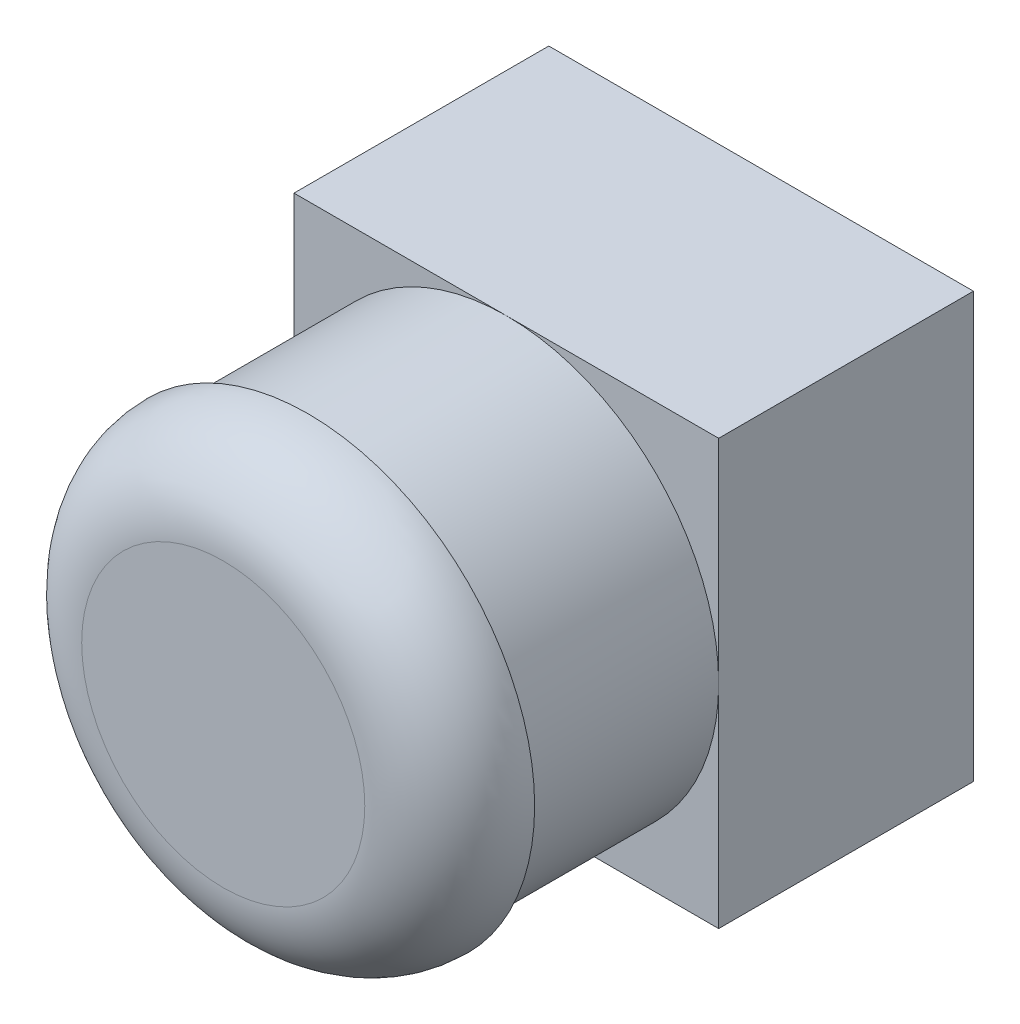
ISO-10303-21;
HEADER;
FILE_DESCRIPTION(('STEP AP214'),'2;1');
FILE_NAME('part.step','',(''),(''),'','','');
FILE_SCHEMA(('AUTOMOTIVE_DESIGN { 1 0 10303 214 1 1 1 1 }'));
ENDSEC;
DATA;
#1=APPLICATION_CONTEXT('core data for automotive mechanical design processes');
#2=APPLICATION_PROTOCOL_DEFINITION('international standard','automotive_design',2000,#1);
#3=PRODUCT_CONTEXT('',#1,'mechanical');
#4=PRODUCT('Part','Part','',(#3));
#5=PRODUCT_RELATED_PRODUCT_CATEGORY('part','',(#4));
#6=PRODUCT_DEFINITION_FORMATION('','',#4);
#7=PRODUCT_DEFINITION_CONTEXT('part definition',#1,'design');
#8=PRODUCT_DEFINITION('design','',#6,#7);
#9=PRODUCT_DEFINITION_SHAPE('','',#8);
#10=(LENGTH_UNIT() NAMED_UNIT(*) SI_UNIT(.MILLI.,.METRE.));
#11=(NAMED_UNIT(*) PLANE_ANGLE_UNIT() SI_UNIT($,.RADIAN.));
#12=(NAMED_UNIT(*) SI_UNIT($,.STERADIAN.) SOLID_ANGLE_UNIT());
#13=UNCERTAINTY_MEASURE_WITH_UNIT(LENGTH_MEASURE(1.E-05),#10,'distance_accuracy_value','');
#14=(GEOMETRIC_REPRESENTATION_CONTEXT(3) GLOBAL_UNCERTAINTY_ASSIGNED_CONTEXT((#13)) GLOBAL_UNIT_ASSIGNED_CONTEXT((#10,
#11,#12)) REPRESENTATION_CONTEXT('',''));
#15=CARTESIAN_POINT('',(0.,0.,0.));
#16=DIRECTION('',(0.,0.,1.));
#17=DIRECTION('',(1.,0.,0.));
#18=AXIS2_PLACEMENT_3D('',#15,#16,#17);
#19=CARTESIAN_POINT('',(0.,0.,9.));
#20=DIRECTION('',(0.,0.,1.));
#21=DIRECTION('',(1.,0.,0.));
#22=AXIS2_PLACEMENT_3D('',#19,#20,#21);
#23=PLANE('',#22);
#24=CARTESIAN_POINT('',(0.,0.,9.));
#25=DIRECTION('',(0.,0.,1.));
#26=DIRECTION('',(1.,0.,0.));
#27=AXIS2_PLACEMENT_3D('',#24,#25,#26);
#28=CIRCLE('',#27,7.5);
#29=CARTESIAN_POINT('',(7.5,0.,9.));
#30=VERTEX_POINT('',#29);
#31=CARTESIAN_POINT('',(0.,7.5,9.));
#32=VERTEX_POINT('',#31);
#33=EDGE_CURVE('E107',#30,#32,#28,.T.);
#34=ORIENTED_EDGE('',*,*,#33,.F.);
#35=DIRECTION('',(0.,1.,0.));
#36=VECTOR('',#35,1.);
#37=CARTESIAN_POINT('',(7.50000000000001,-7.5,9.));
#38=LINE('',#37,#36);
#39=CARTESIAN_POINT('',(7.5,7.5,9.));
#40=VERTEX_POINT('',#39);
#41=EDGE_CURVE('E96',#30,#40,#38,.T.);
#42=ORIENTED_EDGE('',*,*,#41,.T.);
#43=DIRECTION('',(-1.,0.,0.));
#44=VECTOR('',#43,1.);
#45=CARTESIAN_POINT('',(-7.5,7.5,9.));
#46=LINE('',#45,#44);
#47=EDGE_CURVE('E108',#40,#32,#46,.T.);
#48=ORIENTED_EDGE('',*,*,#47,.T.);
#49=EDGE_LOOP('',(#34,#42,#48));
#50=FACE_BOUND('',#49,.T.);
#51=ADVANCED_FACE('F36',(#50),#23,.T.);
#52=CARTESIAN_POINT('',(-7.5,0.,9.));
#53=VERTEX_POINT('',#52);
#54=EDGE_CURVE('E44',#32,#53,#28,.T.);
#55=ORIENTED_EDGE('',*,*,#54,.F.);
#56=CARTESIAN_POINT('',(-7.5,7.5,9.));
#57=VERTEX_POINT('',#56);
#58=EDGE_CURVE('E123',#32,#57,#46,.T.);
#59=ORIENTED_EDGE('',*,*,#58,.T.);
#60=DIRECTION('',(0.,-1.,0.));
#61=VECTOR('',#60,1.);
#62=CARTESIAN_POINT('',(-7.5,-7.5,9.));
#63=LINE('',#62,#61);
#64=EDGE_CURVE('E124',#57,#53,#63,.T.);
#65=ORIENTED_EDGE('',*,*,#64,.T.);
#66=EDGE_LOOP('',(#55,#59,#65));
#67=FACE_BOUND('',#66,.T.);
#68=ADVANCED_FACE('F157',(#67),#23,.T.);
#69=CARTESIAN_POINT('',(0.,-7.5,9.));
#70=VERTEX_POINT('',#69);
#71=EDGE_CURVE('E59',#53,#70,#28,.T.);
#72=ORIENTED_EDGE('',*,*,#71,.F.);
#73=CARTESIAN_POINT('',(-7.5,-7.5,9.));
#74=VERTEX_POINT('',#73);
#75=EDGE_CURVE('E122',#53,#74,#63,.T.);
#76=ORIENTED_EDGE('',*,*,#75,.T.);
#77=DIRECTION('',(1.,0.,0.));
#78=VECTOR('',#77,1.);
#79=CARTESIAN_POINT('',(-7.5,-7.5,9.));
#80=LINE('',#79,#78);
#81=EDGE_CURVE('E105',#74,#70,#80,.T.);
#82=ORIENTED_EDGE('',*,*,#81,.T.);
#83=EDGE_LOOP('',(#72,#76,#82));
#84=FACE_BOUND('',#83,.T.);
#85=ADVANCED_FACE('F159',(#84),#23,.T.);
#86=CARTESIAN_POINT('',(-7.5,7.5,9.));
#87=DIRECTION('',(0.,-1.,0.));
#88=DIRECTION('',(0.,0.,-1.));
#89=AXIS2_PLACEMENT_3D('',#86,#87,#88);
#90=PLANE('',#89);
#91=DIRECTION('',(-1.,0.,0.));
#92=VECTOR('',#91,1.);
#93=CARTESIAN_POINT('',(-7.5,7.5,0.));
#94=LINE('',#93,#92);
#95=CARTESIAN_POINT('',(7.5,7.5,0.));
#96=VERTEX_POINT('',#95);
#97=CARTESIAN_POINT('',(-7.5,7.5,0.));
#98=VERTEX_POINT('',#97);
#99=EDGE_CURVE('E128',#96,#98,#94,.T.);
#100=ORIENTED_EDGE('',*,*,#99,.T.);
#101=DIRECTION('',(0.,0.,-1.));
#102=VECTOR('',#101,1.);
#103=CARTESIAN_POINT('',(-7.5,7.5,9.));
#104=LINE('',#103,#102);
#105=EDGE_CURVE('E115',#57,#98,#104,.T.);
#106=ORIENTED_EDGE('',*,*,#105,.F.);
#107=ORIENTED_EDGE('',*,*,#58,.F.);
#108=ORIENTED_EDGE('',*,*,#47,.F.);
#109=DIRECTION('',(0.,0.,-1.));
#110=VECTOR('',#109,1.);
#111=CARTESIAN_POINT('',(7.5,7.5,9.));
#112=LINE('',#111,#110);
#113=EDGE_CURVE('E95',#40,#96,#112,.T.);
#114=ORIENTED_EDGE('',*,*,#113,.T.);
#115=EDGE_LOOP('',(#100,#106,#107,#108,#114));
#116=FACE_BOUND('',#115,.T.);
#117=ADVANCED_FACE('F152',(#116),#90,.F.);
#118=CARTESIAN_POINT('',(-7.5,-7.5,9.));
#119=DIRECTION('',(1.,0.,0.));
#120=DIRECTION('',(0.,0.,-1.));
#121=AXIS2_PLACEMENT_3D('',#118,#119,#120);
#122=PLANE('',#121);
#123=DIRECTION('',(0.,-1.,0.));
#124=VECTOR('',#123,1.);
#125=CARTESIAN_POINT('',(-7.5,-7.5,0.));
#126=LINE('',#125,#124);
#127=CARTESIAN_POINT('',(-7.5,-7.5,0.));
#128=VERTEX_POINT('',#127);
#129=EDGE_CURVE('E131',#98,#128,#126,.T.);
#130=ORIENTED_EDGE('',*,*,#129,.T.);
#131=DIRECTION('',(0.,0.,-1.));
#132=VECTOR('',#131,1.);
#133=CARTESIAN_POINT('',(-7.5,-7.5,9.));
#134=LINE('',#133,#132);
#135=EDGE_CURVE('E117',#74,#128,#134,.T.);
#136=ORIENTED_EDGE('',*,*,#135,.F.);
#137=ORIENTED_EDGE('',*,*,#75,.F.);
#138=ORIENTED_EDGE('',*,*,#64,.F.);
#139=ORIENTED_EDGE('',*,*,#105,.T.);
#140=EDGE_LOOP('',(#130,#136,#137,#138,#139));
#141=FACE_BOUND('',#140,.T.);
#142=ADVANCED_FACE('F158',(#141),#122,.F.);
#143=CARTESIAN_POINT('',(-7.5,-7.5,9.));
#144=DIRECTION('',(0.,1.,0.));
#145=DIRECTION('',(-1.,0.,0.));
#146=AXIS2_PLACEMENT_3D('',#143,#144,#145);
#147=PLANE('',#146);
#148=DIRECTION('',(1.,0.,0.));
#149=VECTOR('',#148,1.);
#150=CARTESIAN_POINT('',(-7.5,-7.5,0.));
#151=LINE('',#150,#149);
#152=CARTESIAN_POINT('',(7.50000000000001,-7.5,0.));
#153=VERTEX_POINT('',#152);
#154=EDGE_CURVE('E133',#128,#153,#151,.T.);
#155=ORIENTED_EDGE('',*,*,#154,.T.);
#156=DIRECTION('',(0.,0.,-1.));
#157=VECTOR('',#156,1.);
#158=CARTESIAN_POINT('',(7.50000000000001,-7.5,9.));
#159=LINE('',#158,#157);
#160=CARTESIAN_POINT('',(7.50000000000001,-7.5,9.));
#161=VERTEX_POINT('',#160);
#162=EDGE_CURVE('E138',#161,#153,#159,.T.);
#163=ORIENTED_EDGE('',*,*,#162,.F.);
#164=EDGE_CURVE('E91',#70,#161,#80,.T.);
#165=ORIENTED_EDGE('',*,*,#164,.F.);
#166=ORIENTED_EDGE('',*,*,#81,.F.);
#167=ORIENTED_EDGE('',*,*,#135,.T.);
#168=EDGE_LOOP('',(#155,#163,#165,#166,#167));
#169=FACE_BOUND('',#168,.T.);
#170=ADVANCED_FACE('F145',(#169),#147,.F.);
#171=CARTESIAN_POINT('',(7.50000000000001,-7.5,9.));
#172=DIRECTION('',(-1.,0.,0.));
#173=DIRECTION('',(0.,-1.,0.));
#174=AXIS2_PLACEMENT_3D('',#171,#172,#173);
#175=PLANE('',#174);
#176=DIRECTION('',(0.,1.,0.));
#177=VECTOR('',#176,1.);
#178=CARTESIAN_POINT('',(7.50000000000001,-7.5,0.));
#179=LINE('',#178,#177);
#180=EDGE_CURVE('E135',#153,#96,#179,.T.);
#181=ORIENTED_EDGE('',*,*,#180,.T.);
#182=ORIENTED_EDGE('',*,*,#113,.F.);
#183=ORIENTED_EDGE('',*,*,#41,.F.);
#184=EDGE_CURVE('E88',#161,#30,#38,.T.);
#185=ORIENTED_EDGE('',*,*,#184,.F.);
#186=ORIENTED_EDGE('',*,*,#162,.T.);
#187=EDGE_LOOP('',(#181,#182,#183,#185,#186));
#188=FACE_BOUND('',#187,.T.);
#189=ADVANCED_FACE('F100',(#188),#175,.F.);
#190=EDGE_CURVE('E51',#70,#30,#28,.T.);
#191=ORIENTED_EDGE('',*,*,#190,.F.);
#192=ORIENTED_EDGE('',*,*,#164,.T.);
#193=ORIENTED_EDGE('',*,*,#184,.T.);
#194=EDGE_LOOP('',(#191,#192,#193));
#195=FACE_BOUND('',#194,.T.);
#196=ADVANCED_FACE('F90',(#195),#23,.T.);
#197=CARTESIAN_POINT('',(0.,0.,0.));
#198=DIRECTION('',(0.,0.,1.));
#199=DIRECTION('',(1.,0.,0.));
#200=AXIS2_PLACEMENT_3D('',#197,#198,#199);
#201=PLANE('',#200);
#202=ORIENTED_EDGE('',*,*,#99,.F.);
#203=ORIENTED_EDGE('',*,*,#180,.F.);
#204=ORIENTED_EDGE('',*,*,#154,.F.);
#205=ORIENTED_EDGE('',*,*,#129,.F.);
#206=EDGE_LOOP('',(#202,#203,#204,#205));
#207=FACE_BOUND('',#206,.T.);
#208=ADVANCED_FACE('F150',(#207),#201,.F.);
#209=CARTESIAN_POINT('',(0.,0.,16.));
#210=DIRECTION('',(0.,0.,-1.));
#211=DIRECTION('',(-1.,0.,0.));
#212=AXIS2_PLACEMENT_3D('',#209,#210,#211);
#213=CYLINDRICAL_SURFACE('',#212,7.5);
#214=CARTESIAN_POINT('',(0.,0.,16.));
#215=DIRECTION('',(0.,0.,1.));
#216=DIRECTION('',(1.,0.,0.));
#217=AXIS2_PLACEMENT_3D('',#214,#215,#216);
#218=CIRCLE('',#217,7.5);
#219=CARTESIAN_POINT('',(7.5,0.,16.));
#220=VERTEX_POINT('',#219);
#221=EDGE_CURVE('E111',#220,#220,#218,.T.);
#222=ORIENTED_EDGE('',*,*,#221,.F.);
#223=EDGE_LOOP('',(#222));
#224=FACE_BOUND('',#223,.T.);
#225=ORIENTED_EDGE('',*,*,#33,.T.);
#226=ORIENTED_EDGE('',*,*,#54,.T.);
#227=ORIENTED_EDGE('',*,*,#71,.T.);
#228=ORIENTED_EDGE('',*,*,#190,.T.);
#229=EDGE_LOOP('',(#225,#226,#227,#228));
#230=FACE_BOUND('',#229,.T.);
#231=ADVANCED_FACE('F114',(#224,#230),#213,.T.);
#232=CARTESIAN_POINT('',(0.,0.,19.));
#233=DIRECTION('',(0.,0.,1.));
#234=DIRECTION('',(1.,0.,0.));
#235=AXIS2_PLACEMENT_3D('',#232,#233,#234);
#236=PLANE('',#235);
#237=CARTESIAN_POINT('',(0.,0.,19.));
#238=DIRECTION('',(0.,0.,1.));
#239=DIRECTION('',(1.,0.,0.));
#240=AXIS2_PLACEMENT_3D('',#237,#238,#239);
#241=CIRCLE('',#240,5.);
#242=CARTESIAN_POINT('',(5.,0.,19.));
#243=VERTEX_POINT('',#242);
#244=EDGE_CURVE('E11',#243,#243,#241,.T.);
#245=ORIENTED_EDGE('',*,*,#244,.T.);
#246=EDGE_LOOP('',(#245));
#247=FACE_BOUND('',#246,.T.);
#248=ADVANCED_FACE('F228',(#247),#236,.T.);
#249=CARTESIAN_POINT('',(0.,0.,16.));
#250=DIRECTION('',(0.,0.,1.));
#251=DIRECTION('',(1.,0.,0.));
#252=AXIS2_PLACEMENT_3D('',#249,#250,#251);
#253=PLANE('',#252);
#254=ORIENTED_EDGE('',*,*,#221,.T.);
#255=EDGE_LOOP('',(#254));
#256=FACE_BOUND('',#255,.T.);
#257=CARTESIAN_POINT('',(0.,0.,16.));
#258=DIRECTION('',(0.,0.,1.));
#259=DIRECTION('',(1.,0.,0.));
#260=AXIS2_PLACEMENT_3D('',#257,#258,#259);
#261=CIRCLE('',#260,8.);
#262=CARTESIAN_POINT('',(8.,0.,16.));
#263=VERTEX_POINT('',#262);
#264=EDGE_CURVE('E112',#263,#263,#261,.T.);
#265=ORIENTED_EDGE('',*,*,#264,.F.);
#266=EDGE_LOOP('',(#265));
#267=FACE_BOUND('',#266,.T.);
#268=ADVANCED_FACE('F235',(#256,#267),#253,.F.);
#269=CARTESIAN_POINT('',(0.,0.,16.));
#270=DIRECTION('',(0.,0.,1.));
#271=DIRECTION('',(1.,0.,0.));
#272=AXIS2_PLACEMENT_3D('',#269,#270,#271);
#273=TOROIDAL_SURFACE('',#272,5.,3.);
#274=ORIENTED_EDGE('',*,*,#264,.T.);
#275=EDGE_LOOP('',(#274));
#276=FACE_BOUND('',#275,.T.);
#277=ORIENTED_EDGE('',*,*,#244,.F.);
#278=EDGE_LOOP('',(#277));
#279=FACE_BOUND('',#278,.T.);
#280=ADVANCED_FACE('F38',(#276,#279),#273,.T.);
#281=CLOSED_SHELL('',(#51,#68,#85,#117,#142,#170,#189,#196,#208,#231,#248,#268,#280));
#282=MANIFOLD_SOLID_BREP('B2',#281);
#283=ADVANCED_BREP_SHAPE_REPRESENTATION('',(#18,#282),#14);
#284=SHAPE_DEFINITION_REPRESENTATION(#9,#283);
ENDSEC;
END-ISO-10303-21;
